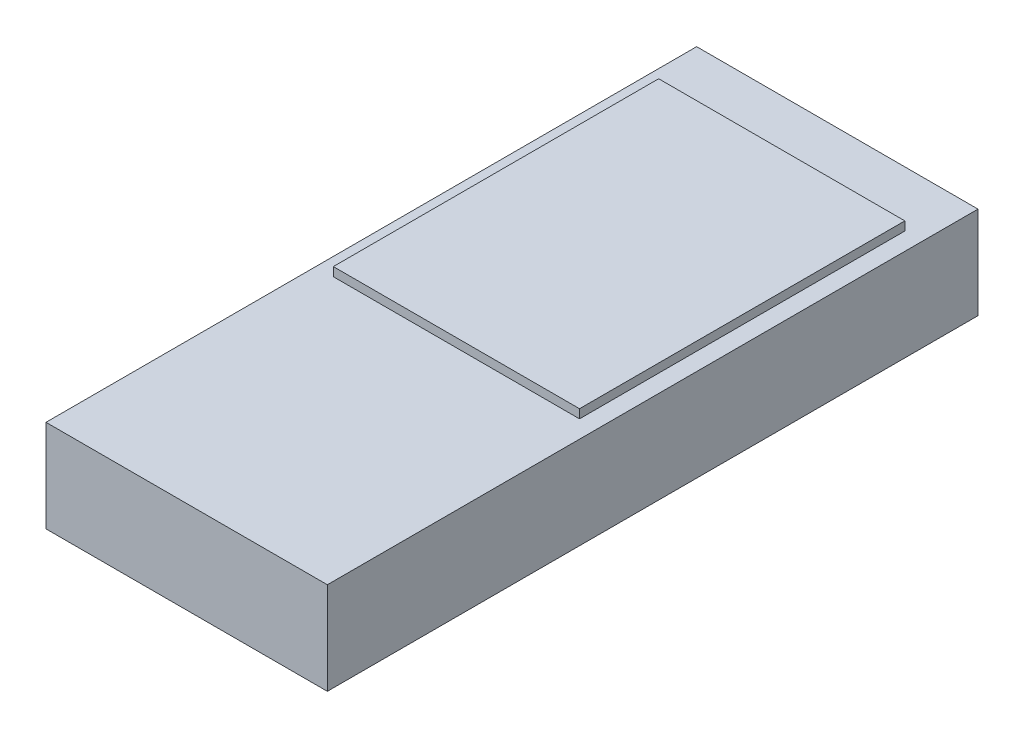
ISO-10303-21;
HEADER;
FILE_DESCRIPTION(('STEP AP214'),'2;1');
FILE_NAME('part.step','',(''),(''),'','','');
FILE_SCHEMA(('AUTOMOTIVE_DESIGN { 1 0 10303 214 1 1 1 1 }'));
ENDSEC;
DATA;
#1=APPLICATION_CONTEXT('core data for automotive mechanical design processes');
#2=APPLICATION_PROTOCOL_DEFINITION('international standard','automotive_design',2000,#1);
#3=PRODUCT_CONTEXT('',#1,'mechanical');
#4=PRODUCT('Part','Part','',(#3));
#5=PRODUCT_RELATED_PRODUCT_CATEGORY('part','',(#4));
#6=PRODUCT_DEFINITION_FORMATION('','',#4);
#7=PRODUCT_DEFINITION_CONTEXT('part definition',#1,'design');
#8=PRODUCT_DEFINITION('design','',#6,#7);
#9=PRODUCT_DEFINITION_SHAPE('','',#8);
#10=(LENGTH_UNIT() NAMED_UNIT(*) SI_UNIT(.MILLI.,.METRE.));
#11=(NAMED_UNIT(*) PLANE_ANGLE_UNIT() SI_UNIT($,.RADIAN.));
#12=(NAMED_UNIT(*) SI_UNIT($,.STERADIAN.) SOLID_ANGLE_UNIT());
#13=UNCERTAINTY_MEASURE_WITH_UNIT(LENGTH_MEASURE(1.E-05),#10,'distance_accuracy_value','');
#14=(GEOMETRIC_REPRESENTATION_CONTEXT(3) GLOBAL_UNCERTAINTY_ASSIGNED_CONTEXT((#13)) GLOBAL_UNIT_ASSIGNED_CONTEXT((#10,
#11,#12)) REPRESENTATION_CONTEXT('',''));
#15=CARTESIAN_POINT('',(0.,0.,0.));
#16=DIRECTION('',(0.,0.,1.));
#17=DIRECTION('',(1.,0.,0.));
#18=AXIS2_PLACEMENT_3D('',#15,#16,#17);
#19=CARTESIAN_POINT('',(0.,26.67,0.));
#20=DIRECTION('',(0.,-1.,0.));
#21=DIRECTION('',(0.,0.,-1.));
#22=AXIS2_PLACEMENT_3D('',#19,#20,#21);
#23=PLANE('',#22);
#24=DIRECTION('',(0.,0.,-1.));
#25=VECTOR('',#24,1.);
#26=CARTESIAN_POINT('',(40.64,26.67,187.96));
#27=LINE('',#26,#25);
#28=CARTESIAN_POINT('',(40.64,26.67,187.96));
#29=VERTEX_POINT('',#28);
#30=CARTESIAN_POINT('',(40.64,26.67,0.));
#31=VERTEX_POINT('',#30);
#32=EDGE_CURVE('E130',#29,#31,#27,.T.);
#33=ORIENTED_EDGE('',*,*,#32,.T.);
#34=DIRECTION('',(-1.,0.,0.));
#35=VECTOR('',#34,1.);
#36=CARTESIAN_POINT('',(-40.64,26.67,0.));
#37=LINE('',#36,#35);
#38=CARTESIAN_POINT('',(-40.64,26.67,0.));
#39=VERTEX_POINT('',#38);
#40=EDGE_CURVE('E133',#31,#39,#37,.T.);
#41=ORIENTED_EDGE('',*,*,#40,.T.);
#42=DIRECTION('',(0.,0.,1.));
#43=VECTOR('',#42,1.);
#44=CARTESIAN_POINT('',(-40.64,26.67,187.96));
#45=LINE('',#44,#43);
#46=CARTESIAN_POINT('',(-40.64,26.67,187.96));
#47=VERTEX_POINT('',#46);
#48=EDGE_CURVE('E136',#39,#47,#45,.T.);
#49=ORIENTED_EDGE('',*,*,#48,.T.);
#50=DIRECTION('',(1.,0.,0.));
#51=VECTOR('',#50,1.);
#52=CARTESIAN_POINT('',(-40.64,26.67,187.96));
#53=LINE('',#52,#51);
#54=EDGE_CURVE('E138',#47,#29,#53,.T.);
#55=ORIENTED_EDGE('',*,*,#54,.T.);
#56=EDGE_LOOP('',(#33,#41,#49,#55));
#57=FACE_BOUND('',#56,.T.);
#58=DIRECTION('',(0.,0.,-1.));
#59=VECTOR('',#58,1.);
#60=CARTESIAN_POINT('',(35.56,26.67,16.0551460390449));
#61=LINE('',#60,#59);
#62=CARTESIAN_POINT('',(35.56,26.67,110.035146039045));
#63=VERTEX_POINT('',#62);
#64=CARTESIAN_POINT('',(35.56,26.67,16.0551460390449));
#65=VERTEX_POINT('',#64);
#66=EDGE_CURVE('E51',#63,#65,#61,.T.);
#67=ORIENTED_EDGE('',*,*,#66,.F.);
#68=DIRECTION('',(1.,0.,0.));
#69=VECTOR('',#68,1.);
#70=CARTESIAN_POINT('',(-35.56,26.67,110.035146039045));
#71=LINE('',#70,#69);
#72=CARTESIAN_POINT('',(-35.56,26.67,110.035146039045));
#73=VERTEX_POINT('',#72);
#74=EDGE_CURVE('E55',#73,#63,#71,.T.);
#75=ORIENTED_EDGE('',*,*,#74,.F.);
#76=DIRECTION('',(0.,0.,1.));
#77=VECTOR('',#76,1.);
#78=CARTESIAN_POINT('',(-35.56,26.67,16.0551460390449));
#79=LINE('',#78,#77);
#80=CARTESIAN_POINT('',(-35.56,26.67,16.0551460390449));
#81=VERTEX_POINT('',#80);
#82=EDGE_CURVE('E263',#81,#73,#79,.T.);
#83=ORIENTED_EDGE('',*,*,#82,.F.);
#84=DIRECTION('',(-1.,0.,0.));
#85=VECTOR('',#84,1.);
#86=CARTESIAN_POINT('',(-35.56,26.67,16.0551460390449));
#87=LINE('',#86,#85);
#88=EDGE_CURVE('E269',#65,#81,#87,.T.);
#89=ORIENTED_EDGE('',*,*,#88,.F.);
#90=EDGE_LOOP('',(#67,#75,#83,#89));
#91=FACE_BOUND('',#90,.T.);
#92=ADVANCED_FACE('F36',(#57,#91),#23,.F.);
#93=CARTESIAN_POINT('',(40.64,26.67,187.96));
#94=DIRECTION('',(-1.,0.,0.));
#95=DIRECTION('',(0.,0.,1.));
#96=AXIS2_PLACEMENT_3D('',#93,#94,#95);
#97=PLANE('',#96);
#98=DIRECTION('',(0.,0.,-1.));
#99=VECTOR('',#98,1.);
#100=CARTESIAN_POINT('',(40.64,0.,187.96));
#101=LINE('',#100,#99);
#102=CARTESIAN_POINT('',(40.64,0.,187.96));
#103=VERTEX_POINT('',#102);
#104=CARTESIAN_POINT('',(40.64,0.,0.));
#105=VERTEX_POINT('',#104);
#106=EDGE_CURVE('E121',#103,#105,#101,.T.);
#107=ORIENTED_EDGE('',*,*,#106,.T.);
#108=DIRECTION('',(0.,-1.,0.));
#109=VECTOR('',#108,1.);
#110=CARTESIAN_POINT('',(40.64,26.67,0.));
#111=LINE('',#110,#109);
#112=EDGE_CURVE('E11',#31,#105,#111,.T.);
#113=ORIENTED_EDGE('',*,*,#112,.F.);
#114=ORIENTED_EDGE('',*,*,#32,.F.);
#115=DIRECTION('',(0.,-1.,0.));
#116=VECTOR('',#115,1.);
#117=CARTESIAN_POINT('',(40.64,26.67,187.96));
#118=LINE('',#117,#116);
#119=EDGE_CURVE('E139',#29,#103,#118,.T.);
#120=ORIENTED_EDGE('',*,*,#119,.T.);
#121=EDGE_LOOP('',(#107,#113,#114,#120));
#122=FACE_BOUND('',#121,.T.);
#123=ADVANCED_FACE('F38',(#122),#97,.F.);
#124=CARTESIAN_POINT('',(-40.64,26.67,0.));
#125=DIRECTION('',(0.,0.,1.));
#126=DIRECTION('',(1.,0.,0.));
#127=AXIS2_PLACEMENT_3D('',#124,#125,#126);
#128=PLANE('',#127);
#129=DIRECTION('',(-1.,0.,0.));
#130=VECTOR('',#129,1.);
#131=CARTESIAN_POINT('',(-40.64,0.,0.));
#132=LINE('',#131,#130);
#133=CARTESIAN_POINT('',(-40.64,0.,0.));
#134=VERTEX_POINT('',#133);
#135=EDGE_CURVE('E124',#105,#134,#132,.T.);
#136=ORIENTED_EDGE('',*,*,#135,.T.);
#137=DIRECTION('',(0.,-1.,0.));
#138=VECTOR('',#137,1.);
#139=CARTESIAN_POINT('',(-40.64,26.67,0.));
#140=LINE('',#139,#138);
#141=EDGE_CURVE('E44',#39,#134,#140,.T.);
#142=ORIENTED_EDGE('',*,*,#141,.F.);
#143=ORIENTED_EDGE('',*,*,#40,.F.);
#144=ORIENTED_EDGE('',*,*,#112,.T.);
#145=EDGE_LOOP('',(#136,#142,#143,#144));
#146=FACE_BOUND('',#145,.T.);
#147=ADVANCED_FACE('F169',(#146),#128,.F.);
#148=CARTESIAN_POINT('',(-40.64,26.67,187.96));
#149=DIRECTION('',(1.,0.,0.));
#150=DIRECTION('',(0.,0.,-1.));
#151=AXIS2_PLACEMENT_3D('',#148,#149,#150);
#152=PLANE('',#151);
#153=DIRECTION('',(0.,0.,1.));
#154=VECTOR('',#153,1.);
#155=CARTESIAN_POINT('',(-40.64,0.,187.96));
#156=LINE('',#155,#154);
#157=CARTESIAN_POINT('',(-40.64,0.,187.96));
#158=VERTEX_POINT('',#157);
#159=EDGE_CURVE('E142',#134,#158,#156,.T.);
#160=ORIENTED_EDGE('',*,*,#159,.T.);
#161=DIRECTION('',(0.,-1.,0.));
#162=VECTOR('',#161,1.);
#163=CARTESIAN_POINT('',(-40.64,26.67,187.96));
#164=LINE('',#163,#162);
#165=EDGE_CURVE('E147',#47,#158,#164,.T.);
#166=ORIENTED_EDGE('',*,*,#165,.F.);
#167=ORIENTED_EDGE('',*,*,#48,.F.);
#168=ORIENTED_EDGE('',*,*,#141,.T.);
#169=EDGE_LOOP('',(#160,#166,#167,#168));
#170=FACE_BOUND('',#169,.T.);
#171=ADVANCED_FACE('F154',(#170),#152,.F.);
#172=CARTESIAN_POINT('',(-40.64,26.67,187.96));
#173=DIRECTION('',(0.,0.,-1.));
#174=DIRECTION('',(-1.,0.,0.));
#175=AXIS2_PLACEMENT_3D('',#172,#173,#174);
#176=PLANE('',#175);
#177=DIRECTION('',(1.,0.,0.));
#178=VECTOR('',#177,1.);
#179=CARTESIAN_POINT('',(-40.64,0.,187.96));
#180=LINE('',#179,#178);
#181=EDGE_CURVE('E134',#158,#103,#180,.T.);
#182=ORIENTED_EDGE('',*,*,#181,.T.);
#183=ORIENTED_EDGE('',*,*,#119,.F.);
#184=ORIENTED_EDGE('',*,*,#54,.F.);
#185=ORIENTED_EDGE('',*,*,#165,.T.);
#186=EDGE_LOOP('',(#182,#183,#184,#185));
#187=FACE_BOUND('',#186,.T.);
#188=ADVANCED_FACE('F163',(#187),#176,.F.);
#189=CARTESIAN_POINT('',(0.,0.,0.));
#190=DIRECTION('',(0.,-1.,0.));
#191=DIRECTION('',(0.,0.,-1.));
#192=AXIS2_PLACEMENT_3D('',#189,#190,#191);
#193=PLANE('',#192);
#194=ORIENTED_EDGE('',*,*,#106,.F.);
#195=ORIENTED_EDGE('',*,*,#181,.F.);
#196=ORIENTED_EDGE('',*,*,#159,.F.);
#197=ORIENTED_EDGE('',*,*,#135,.F.);
#198=EDGE_LOOP('',(#194,#195,#196,#197));
#199=FACE_BOUND('',#198,.T.);
#200=ADVANCED_FACE('F160',(#199),#193,.T.);
#201=CARTESIAN_POINT('',(35.56,29.21,16.0551460390449));
#202=DIRECTION('',(-1.,0.,0.));
#203=DIRECTION('',(0.,0.,1.));
#204=AXIS2_PLACEMENT_3D('',#201,#202,#203);
#205=PLANE('',#204);
#206=ORIENTED_EDGE('',*,*,#66,.T.);
#207=DIRECTION('',(0.,-1.,0.));
#208=VECTOR('',#207,1.);
#209=CARTESIAN_POINT('',(35.56,29.21,16.0551460390449));
#210=LINE('',#209,#208);
#211=CARTESIAN_POINT('',(35.56,29.21,16.0551460390449));
#212=VERTEX_POINT('',#211);
#213=EDGE_CURVE('E104',#212,#65,#210,.T.);
#214=ORIENTED_EDGE('',*,*,#213,.F.);
#215=DIRECTION('',(0.,0.,-1.));
#216=VECTOR('',#215,1.);
#217=CARTESIAN_POINT('',(35.56,29.21,16.0551460390449));
#218=LINE('',#217,#216);
#219=CARTESIAN_POINT('',(35.56,29.21,110.035146039045));
#220=VERTEX_POINT('',#219);
#221=EDGE_CURVE('E110',#220,#212,#218,.T.);
#222=ORIENTED_EDGE('',*,*,#221,.F.);
#223=DIRECTION('',(0.,-1.,0.));
#224=VECTOR('',#223,1.);
#225=CARTESIAN_POINT('',(35.56,29.21,110.035146039045));
#226=LINE('',#225,#224);
#227=EDGE_CURVE('E261',#220,#63,#226,.T.);
#228=ORIENTED_EDGE('',*,*,#227,.T.);
#229=EDGE_LOOP('',(#206,#214,#222,#228));
#230=FACE_BOUND('',#229,.T.);
#231=ADVANCED_FACE('F120',(#230),#205,.F.);
#232=CARTESIAN_POINT('',(-35.56,29.21,16.0551460390449));
#233=DIRECTION('',(0.,0.,1.));
#234=DIRECTION('',(1.,0.,0.));
#235=AXIS2_PLACEMENT_3D('',#232,#233,#234);
#236=PLANE('',#235);
#237=ORIENTED_EDGE('',*,*,#88,.T.);
#238=DIRECTION('',(0.,-1.,0.));
#239=VECTOR('',#238,1.);
#240=CARTESIAN_POINT('',(-35.56,29.21,16.0551460390449));
#241=LINE('',#240,#239);
#242=CARTESIAN_POINT('',(-35.56,29.21,16.0551460390449));
#243=VERTEX_POINT('',#242);
#244=EDGE_CURVE('E106',#243,#81,#241,.T.);
#245=ORIENTED_EDGE('',*,*,#244,.F.);
#246=DIRECTION('',(-1.,0.,0.));
#247=VECTOR('',#246,1.);
#248=CARTESIAN_POINT('',(-35.56,29.21,16.0551460390449));
#249=LINE('',#248,#247);
#250=EDGE_CURVE('E99',#212,#243,#249,.T.);
#251=ORIENTED_EDGE('',*,*,#250,.F.);
#252=ORIENTED_EDGE('',*,*,#213,.T.);
#253=EDGE_LOOP('',(#237,#245,#251,#252));
#254=FACE_BOUND('',#253,.T.);
#255=ADVANCED_FACE('F102',(#254),#236,.F.);
#256=CARTESIAN_POINT('',(-35.56,29.21,16.0551460390449));
#257=DIRECTION('',(1.,0.,0.));
#258=DIRECTION('',(0.,0.,-1.));
#259=AXIS2_PLACEMENT_3D('',#256,#257,#258);
#260=PLANE('',#259);
#261=ORIENTED_EDGE('',*,*,#82,.T.);
#262=DIRECTION('',(0.,-1.,0.));
#263=VECTOR('',#262,1.);
#264=CARTESIAN_POINT('',(-35.56,29.21,110.035146039045));
#265=LINE('',#264,#263);
#266=CARTESIAN_POINT('',(-35.56,29.21,110.035146039045));
#267=VERTEX_POINT('',#266);
#268=EDGE_CURVE('E126',#267,#73,#265,.T.);
#269=ORIENTED_EDGE('',*,*,#268,.F.);
#270=DIRECTION('',(0.,0.,1.));
#271=VECTOR('',#270,1.);
#272=CARTESIAN_POINT('',(-35.56,29.21,16.0551460390449));
#273=LINE('',#272,#271);
#274=EDGE_CURVE('E109',#243,#267,#273,.T.);
#275=ORIENTED_EDGE('',*,*,#274,.F.);
#276=ORIENTED_EDGE('',*,*,#244,.T.);
#277=EDGE_LOOP('',(#261,#269,#275,#276));
#278=FACE_BOUND('',#277,.T.);
#279=ADVANCED_FACE('F205',(#278),#260,.F.);
#280=CARTESIAN_POINT('',(-35.56,29.21,110.035146039045));
#281=DIRECTION('',(0.,0.,-1.));
#282=DIRECTION('',(-1.,0.,0.));
#283=AXIS2_PLACEMENT_3D('',#280,#281,#282);
#284=PLANE('',#283);
#285=ORIENTED_EDGE('',*,*,#74,.T.);
#286=ORIENTED_EDGE('',*,*,#227,.F.);
#287=DIRECTION('',(1.,0.,0.));
#288=VECTOR('',#287,1.);
#289=CARTESIAN_POINT('',(-35.56,29.21,110.035146039045));
#290=LINE('',#289,#288);
#291=EDGE_CURVE('E115',#267,#220,#290,.T.);
#292=ORIENTED_EDGE('',*,*,#291,.F.);
#293=ORIENTED_EDGE('',*,*,#268,.T.);
#294=EDGE_LOOP('',(#285,#286,#292,#293));
#295=FACE_BOUND('',#294,.T.);
#296=ADVANCED_FACE('F211',(#295),#284,.F.);
#297=CARTESIAN_POINT('',(0.,29.21,0.));
#298=DIRECTION('',(0.,1.,0.));
#299=DIRECTION('',(0.,0.,1.));
#300=AXIS2_PLACEMENT_3D('',#297,#298,#299);
#301=PLANE('',#300);
#302=ORIENTED_EDGE('',*,*,#221,.T.);
#303=ORIENTED_EDGE('',*,*,#250,.T.);
#304=ORIENTED_EDGE('',*,*,#274,.T.);
#305=ORIENTED_EDGE('',*,*,#291,.T.);
#306=EDGE_LOOP('',(#302,#303,#304,#305));
#307=FACE_BOUND('',#306,.T.);
#308=ADVANCED_FACE('F113',(#307),#301,.T.);
#309=CLOSED_SHELL('',(#92,#123,#147,#171,#188,#200,#231,#255,#279,#296,#308));
#310=MANIFOLD_SOLID_BREP('B2',#309);
#311=ADVANCED_BREP_SHAPE_REPRESENTATION('',(#18,#310),#14);
#312=SHAPE_DEFINITION_REPRESENTATION(#9,#311);
ENDSEC;
END-ISO-10303-21;
